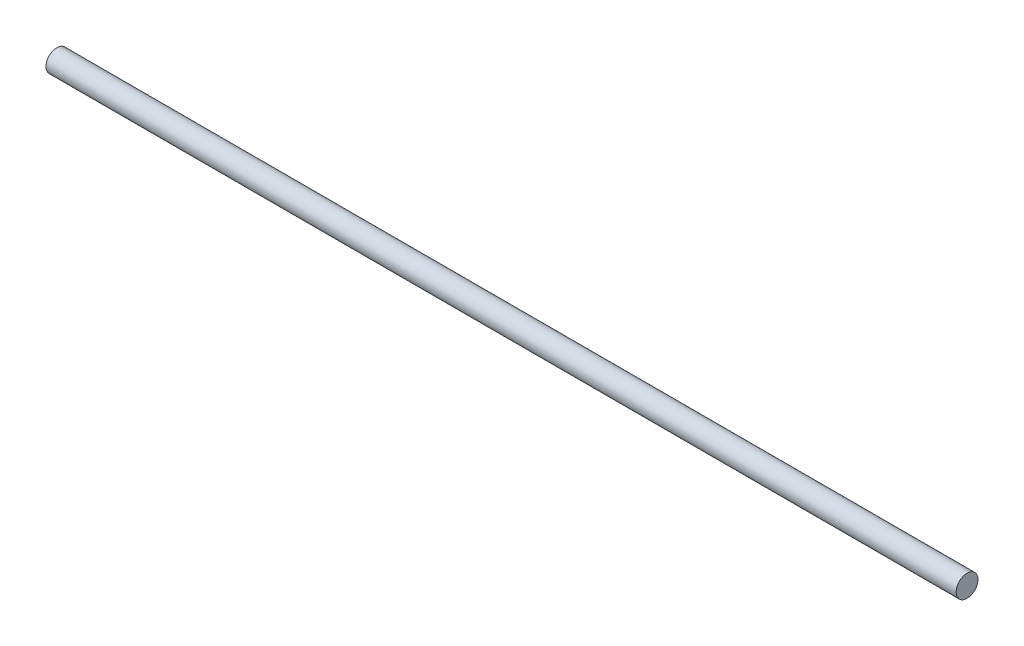
ISO-10303-21;
HEADER;
FILE_DESCRIPTION(('STEP AP214'),'2;1');
FILE_NAME('part.step','',(''),(''),'','','');
FILE_SCHEMA(('AUTOMOTIVE_DESIGN { 1 0 10303 214 1 1 1 1 }'));
ENDSEC;
DATA;
#1=APPLICATION_CONTEXT('core data for automotive mechanical design processes');
#2=APPLICATION_PROTOCOL_DEFINITION('international standard','automotive_design',2000,#1);
#3=PRODUCT_CONTEXT('',#1,'mechanical');
#4=PRODUCT('Part','Part','',(#3));
#5=PRODUCT_RELATED_PRODUCT_CATEGORY('part','',(#4));
#6=PRODUCT_DEFINITION_FORMATION('','',#4);
#7=PRODUCT_DEFINITION_CONTEXT('part definition',#1,'design');
#8=PRODUCT_DEFINITION('design','',#6,#7);
#9=PRODUCT_DEFINITION_SHAPE('','',#8);
#10=(LENGTH_UNIT() NAMED_UNIT(*) SI_UNIT(.MILLI.,.METRE.));
#11=(NAMED_UNIT(*) PLANE_ANGLE_UNIT() SI_UNIT($,.RADIAN.));
#12=(NAMED_UNIT(*) SI_UNIT($,.STERADIAN.) SOLID_ANGLE_UNIT());
#13=UNCERTAINTY_MEASURE_WITH_UNIT(LENGTH_MEASURE(1.E-05),#10,'distance_accuracy_value','');
#14=(GEOMETRIC_REPRESENTATION_CONTEXT(3) GLOBAL_UNCERTAINTY_ASSIGNED_CONTEXT((#13)) GLOBAL_UNIT_ASSIGNED_CONTEXT((#10,
#11,#12)) REPRESENTATION_CONTEXT('',''));
#15=CARTESIAN_POINT('',(0.,0.,0.));
#16=DIRECTION('',(0.,0.,1.));
#17=DIRECTION('',(1.,0.,0.));
#18=AXIS2_PLACEMENT_3D('',#15,#16,#17);
#19=CARTESIAN_POINT('',(500.,0.,0.));
#20=DIRECTION('',(-1.,0.,0.));
#21=DIRECTION('',(0.,0.,1.));
#22=AXIS2_PLACEMENT_3D('',#19,#20,#21);
#23=CYLINDRICAL_SURFACE('',#22,6.);
#24=CARTESIAN_POINT('',(500.,0.,0.));
#25=DIRECTION('',(1.,0.,0.));
#26=DIRECTION('',(0.,0.,-1.));
#27=AXIS2_PLACEMENT_3D('',#24,#25,#26);
#28=CIRCLE('',#27,6.);
#29=CARTESIAN_POINT('',(500.,0.,-6.));
#30=VERTEX_POINT('',#29);
#31=EDGE_CURVE('E10',#30,#30,#28,.T.);
#32=ORIENTED_EDGE('',*,*,#31,.F.);
#33=EDGE_LOOP('',(#32));
#34=FACE_BOUND('',#33,.T.);
#35=CARTESIAN_POINT('',(0.,0.,0.));
#36=DIRECTION('',(1.,0.,0.));
#37=DIRECTION('',(0.,0.,-1.));
#38=AXIS2_PLACEMENT_3D('',#35,#36,#37);
#39=CIRCLE('',#38,6.);
#40=CARTESIAN_POINT('',(0.,0.,-6.));
#41=VERTEX_POINT('',#40);
#42=EDGE_CURVE('E35',#41,#41,#39,.T.);
#43=ORIENTED_EDGE('',*,*,#42,.T.);
#44=EDGE_LOOP('',(#43));
#45=FACE_BOUND('',#44,.T.);
#46=ADVANCED_FACE('F32',(#34,#45),#23,.T.);
#47=CARTESIAN_POINT('',(500.,0.,0.));
#48=DIRECTION('',(1.,0.,0.));
#49=DIRECTION('',(0.,0.,-1.));
#50=AXIS2_PLACEMENT_3D('',#47,#48,#49);
#51=PLANE('',#50);
#52=ORIENTED_EDGE('',*,*,#31,.T.);
#53=EDGE_LOOP('',(#52));
#54=FACE_BOUND('',#53,.T.);
#55=ADVANCED_FACE('F47',(#54),#51,.T.);
#56=CARTESIAN_POINT('',(0.,0.,0.));
#57=DIRECTION('',(1.,0.,0.));
#58=DIRECTION('',(0.,0.,-1.));
#59=AXIS2_PLACEMENT_3D('',#56,#57,#58);
#60=PLANE('',#59);
#61=ORIENTED_EDGE('',*,*,#42,.F.);
#62=EDGE_LOOP('',(#61));
#63=FACE_BOUND('',#62,.T.);
#64=ADVANCED_FACE('F45',(#63),#60,.F.);
#65=CLOSED_SHELL('',(#46,#55,#64));
#66=MANIFOLD_SOLID_BREP('B2',#65);
#67=ADVANCED_BREP_SHAPE_REPRESENTATION('',(#18,#66),#14);
#68=SHAPE_DEFINITION_REPRESENTATION(#9,#67);
ENDSEC;
END-ISO-10303-21;
